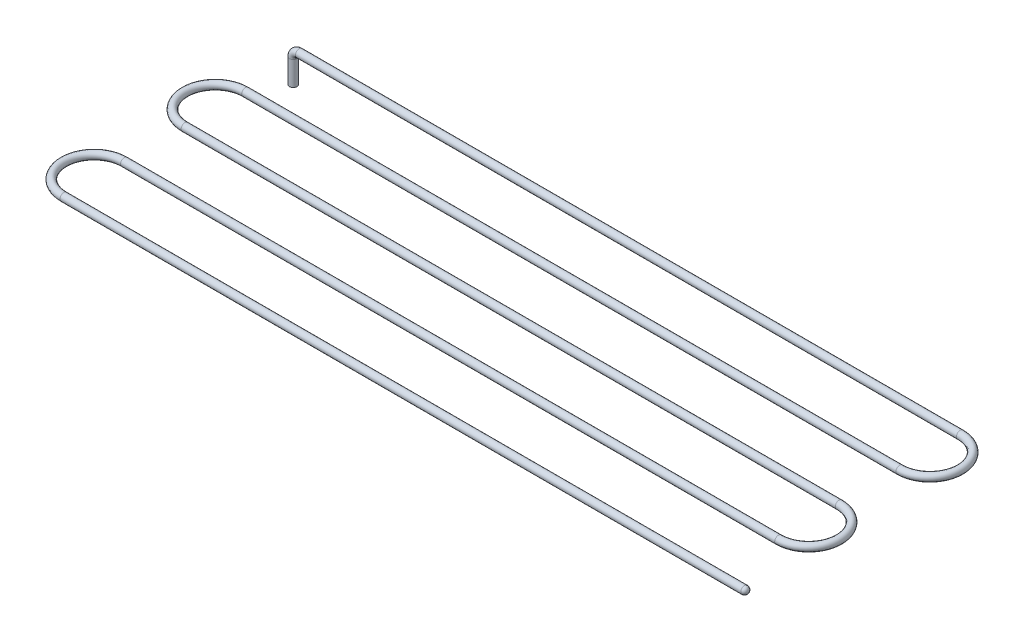
ISO-10303-21;
HEADER;
FILE_DESCRIPTION(('STEP AP214'),'2;1');
FILE_NAME('part.step','',(''),(''),'','','');
FILE_SCHEMA(('AUTOMOTIVE_DESIGN { 1 0 10303 214 1 1 1 1 }'));
ENDSEC;
DATA;
#1=APPLICATION_CONTEXT('core data for automotive mechanical design processes');
#2=APPLICATION_PROTOCOL_DEFINITION('international standard','automotive_design',2000,#1);
#3=PRODUCT_CONTEXT('',#1,'mechanical');
#4=PRODUCT('Part','Part','',(#3));
#5=PRODUCT_RELATED_PRODUCT_CATEGORY('part','',(#4));
#6=PRODUCT_DEFINITION_FORMATION('','',#4);
#7=PRODUCT_DEFINITION_CONTEXT('part definition',#1,'design');
#8=PRODUCT_DEFINITION('design','',#6,#7);
#9=PRODUCT_DEFINITION_SHAPE('','',#8);
#10=(LENGTH_UNIT() NAMED_UNIT(*) SI_UNIT(.MILLI.,.METRE.));
#11=(NAMED_UNIT(*) PLANE_ANGLE_UNIT() SI_UNIT($,.RADIAN.));
#12=(NAMED_UNIT(*) SI_UNIT($,.STERADIAN.) SOLID_ANGLE_UNIT());
#13=UNCERTAINTY_MEASURE_WITH_UNIT(LENGTH_MEASURE(1.E-05),#10,'distance_accuracy_value','');
#14=(GEOMETRIC_REPRESENTATION_CONTEXT(3) GLOBAL_UNCERTAINTY_ASSIGNED_CONTEXT((#13)) GLOBAL_UNIT_ASSIGNED_CONTEXT((#10,
#11,#12)) REPRESENTATION_CONTEXT('',''));
#15=CARTESIAN_POINT('',(0.,0.,0.));
#16=DIRECTION('',(0.,0.,1.));
#17=DIRECTION('',(1.,0.,0.));
#18=AXIS2_PLACEMENT_3D('',#15,#16,#17);
#19=CARTESIAN_POINT('',(451.999999999999,0.,-160.));
#20=DIRECTION('',(-1.,0.,0.));
#21=DIRECTION('',(0.,0.,1.));
#22=AXIS2_PLACEMENT_3D('',#19,#20,#21);
#23=CYLINDRICAL_SURFACE('',#22,2.5);
#24=CARTESIAN_POINT('',(451.999999999999,0.,-160.));
#25=DIRECTION('',(1.,0.,0.));
#26=DIRECTION('',(0.,0.,-1.));
#27=AXIS2_PLACEMENT_3D('',#24,#25,#26);
#28=CIRCLE('',#27,2.5);
#29=CARTESIAN_POINT('',(451.999999999999,0.,-162.5));
#30=VERTEX_POINT('',#29);
#31=EDGE_CURVE('E46',#30,#30,#28,.T.);
#32=ORIENTED_EDGE('',*,*,#31,.F.);
#33=EDGE_LOOP('',(#32));
#34=FACE_BOUND('',#33,.T.);
#35=CARTESIAN_POINT('',(15.4999999999995,0.,-160.));
#36=DIRECTION('',(-1.,0.,0.));
#37=DIRECTION('',(0.,0.,1.));
#38=AXIS2_PLACEMENT_3D('',#35,#36,#37);
#39=CIRCLE('',#38,2.5);
#40=CARTESIAN_POINT('',(15.4999999999995,2.5,-160.));
#41=VERTEX_POINT('',#40);
#42=EDGE_CURVE('E79',#41,#41,#39,.T.);
#43=ORIENTED_EDGE('',*,*,#42,.F.);
#44=EDGE_LOOP('',(#43));
#45=FACE_BOUND('',#44,.T.);
#46=ADVANCED_FACE('F35',(#34,#45),#23,.T.);
#47=CARTESIAN_POINT('',(452.,0.,-140.));
#48=DIRECTION('',(0.,1.,0.));
#49=DIRECTION('',(0.,0.,1.));
#50=AXIS2_PLACEMENT_3D('',#47,#48,#49);
#51=TOROIDAL_SURFACE('',#50,20.,2.5);
#52=CARTESIAN_POINT('',(452.000000000001,0.,-120.));
#53=DIRECTION('',(-1.,0.,0.));
#54=DIRECTION('',(0.,0.,1.));
#55=AXIS2_PLACEMENT_3D('',#52,#53,#54);
#56=CIRCLE('',#55,2.5);
#57=CARTESIAN_POINT('',(452.000000000001,0.,-117.5));
#58=VERTEX_POINT('',#57);
#59=EDGE_CURVE('E50',#58,#58,#56,.T.);
#60=CARTESIAN_POINT('',(452.,0.,-140.));
#61=DIRECTION('',(0.,1.,0.));
#62=DIRECTION('',(0.,0.,1.));
#63=AXIS2_PLACEMENT_3D('',#60,#61,#62);
#64=CIRCLE('',#63,22.5);
#65=EDGE_CURVE('',#58,#30,#64,.T.);
#66=ORIENTED_EDGE('',*,*,#59,.F.);
#67=ORIENTED_EDGE('',*,*,#31,.T.);
#68=ORIENTED_EDGE('',*,*,#65,.T.);
#69=ORIENTED_EDGE('',*,*,#65,.F.);
#70=EDGE_LOOP('',(#66,#68,#67,#69));
#71=FACE_BOUND('',#70,.T.);
#72=ADVANCED_FACE('F87',(#71),#51,.T.);
#73=CARTESIAN_POINT('',(20.0000000000005,0.,-120.));
#74=DIRECTION('',(1.,0.,0.));
#75=DIRECTION('',(0.,0.,-1.));
#76=AXIS2_PLACEMENT_3D('',#73,#74,#75);
#77=CYLINDRICAL_SURFACE('',#76,2.5);
#78=CARTESIAN_POINT('',(20.0000000000005,0.,-120.));
#79=DIRECTION('',(-1.,0.,0.));
#80=DIRECTION('',(0.,0.,1.));
#81=AXIS2_PLACEMENT_3D('',#78,#79,#80);
#82=CIRCLE('',#81,2.5);
#83=CARTESIAN_POINT('',(20.0000000000006,0.,-122.5));
#84=VERTEX_POINT('',#83);
#85=EDGE_CURVE('E55',#84,#84,#82,.T.);
#86=ORIENTED_EDGE('',*,*,#85,.F.);
#87=EDGE_LOOP('',(#86));
#88=FACE_BOUND('',#87,.T.);
#89=ORIENTED_EDGE('',*,*,#59,.T.);
#90=EDGE_LOOP('',(#89));
#91=FACE_BOUND('',#90,.T.);
#92=ADVANCED_FACE('F92',(#88,#91),#77,.T.);
#93=CARTESIAN_POINT('',(20.,0.,-100.));
#94=DIRECTION('',(0.,-1.,0.));
#95=DIRECTION('',(0.,0.,-1.));
#96=AXIS2_PLACEMENT_3D('',#93,#94,#95);
#97=TOROIDAL_SURFACE('',#96,20.,2.5);
#98=CARTESIAN_POINT('',(19.9999999999997,0.,-80.));
#99=DIRECTION('',(1.,0.,0.));
#100=DIRECTION('',(0.,0.,-1.));
#101=AXIS2_PLACEMENT_3D('',#98,#99,#100);
#102=CIRCLE('',#101,2.5);
#103=CARTESIAN_POINT('',(19.9999999999997,0.,-77.5));
#104=VERTEX_POINT('',#103);
#105=EDGE_CURVE('E58',#104,#104,#102,.T.);
#106=CARTESIAN_POINT('',(20.,0.,-100.));
#107=DIRECTION('',(0.,-1.,0.));
#108=DIRECTION('',(0.,0.,-1.));
#109=AXIS2_PLACEMENT_3D('',#106,#107,#108);
#110=CIRCLE('',#109,22.5);
#111=EDGE_CURVE('',#104,#84,#110,.T.);
#112=ORIENTED_EDGE('',*,*,#105,.F.);
#113=ORIENTED_EDGE('',*,*,#85,.T.);
#114=ORIENTED_EDGE('',*,*,#111,.T.);
#115=ORIENTED_EDGE('',*,*,#111,.F.);
#116=EDGE_LOOP('',(#112,#114,#113,#115));
#117=FACE_BOUND('',#116,.T.);
#118=ADVANCED_FACE('F99',(#117),#97,.T.);
#119=CARTESIAN_POINT('',(452.,0.,-80.));
#120=DIRECTION('',(-1.,0.,0.));
#121=DIRECTION('',(0.,0.,1.));
#122=AXIS2_PLACEMENT_3D('',#119,#120,#121);
#123=CYLINDRICAL_SURFACE('',#122,2.5);
#124=CARTESIAN_POINT('',(452.,0.,-80.));
#125=DIRECTION('',(1.,0.,0.));
#126=DIRECTION('',(0.,0.,-1.));
#127=AXIS2_PLACEMENT_3D('',#124,#125,#126);
#128=CIRCLE('',#127,2.5);
#129=CARTESIAN_POINT('',(452.,0.,-82.5));
#130=VERTEX_POINT('',#129);
#131=EDGE_CURVE('E61',#130,#130,#128,.T.);
#132=ORIENTED_EDGE('',*,*,#131,.F.);
#133=EDGE_LOOP('',(#132));
#134=FACE_BOUND('',#133,.T.);
#135=ORIENTED_EDGE('',*,*,#105,.T.);
#136=EDGE_LOOP('',(#135));
#137=FACE_BOUND('',#136,.T.);
#138=ADVANCED_FACE('F103',(#134,#137),#123,.T.);
#139=CARTESIAN_POINT('',(452.,0.,-60.));
#140=DIRECTION('',(0.,1.,0.));
#141=DIRECTION('',(0.,0.,1.));
#142=AXIS2_PLACEMENT_3D('',#139,#140,#141);
#143=TOROIDAL_SURFACE('',#142,20.,2.5);
#144=CARTESIAN_POINT('',(452.,0.,-40.));
#145=DIRECTION('',(-1.,0.,0.));
#146=DIRECTION('',(0.,0.,1.));
#147=AXIS2_PLACEMENT_3D('',#144,#145,#146);
#148=CIRCLE('',#147,2.5);
#149=CARTESIAN_POINT('',(452.,0.,-37.5));
#150=VERTEX_POINT('',#149);
#151=EDGE_CURVE('E64',#150,#150,#148,.T.);
#152=CARTESIAN_POINT('',(452.,0.,-60.));
#153=DIRECTION('',(0.,1.,0.));
#154=DIRECTION('',(0.,0.,1.));
#155=AXIS2_PLACEMENT_3D('',#152,#153,#154);
#156=CIRCLE('',#155,22.5);
#157=EDGE_CURVE('',#150,#130,#156,.T.);
#158=ORIENTED_EDGE('',*,*,#151,.F.);
#159=ORIENTED_EDGE('',*,*,#131,.T.);
#160=ORIENTED_EDGE('',*,*,#157,.T.);
#161=ORIENTED_EDGE('',*,*,#157,.F.);
#162=EDGE_LOOP('',(#158,#160,#159,#161));
#163=FACE_BOUND('',#162,.T.);
#164=ADVANCED_FACE('F107',(#163),#143,.T.);
#165=CARTESIAN_POINT('',(20.0000000000003,0.,-40.));
#166=DIRECTION('',(1.,0.,0.));
#167=DIRECTION('',(0.,0.,-1.));
#168=AXIS2_PLACEMENT_3D('',#165,#166,#167);
#169=CYLINDRICAL_SURFACE('',#168,2.5);
#170=CARTESIAN_POINT('',(20.0000000000003,0.,-40.));
#171=DIRECTION('',(-1.,0.,0.));
#172=DIRECTION('',(0.,0.,1.));
#173=AXIS2_PLACEMENT_3D('',#170,#171,#172);
#174=CIRCLE('',#173,2.5);
#175=CARTESIAN_POINT('',(20.0000000000003,0.,-42.5));
#176=VERTEX_POINT('',#175);
#177=EDGE_CURVE('E67',#176,#176,#174,.T.);
#178=ORIENTED_EDGE('',*,*,#177,.F.);
#179=EDGE_LOOP('',(#178));
#180=FACE_BOUND('',#179,.T.);
#181=ORIENTED_EDGE('',*,*,#151,.T.);
#182=EDGE_LOOP('',(#181));
#183=FACE_BOUND('',#182,.T.);
#184=ADVANCED_FACE('F111',(#180,#183),#169,.T.);
#185=CARTESIAN_POINT('',(20.,0.,-20.));
#186=DIRECTION('',(0.,-1.,0.));
#187=DIRECTION('',(0.,0.,-1.));
#188=AXIS2_PLACEMENT_3D('',#185,#186,#187);
#189=TOROIDAL_SURFACE('',#188,20.,2.5);
#190=CARTESIAN_POINT('',(20.,0.,0.));
#191=DIRECTION('',(1.,0.,0.));
#192=DIRECTION('',(0.,0.,-1.));
#193=AXIS2_PLACEMENT_3D('',#190,#191,#192);
#194=CIRCLE('',#193,2.5);
#195=CARTESIAN_POINT('',(20.,0.,2.5));
#196=VERTEX_POINT('',#195);
#197=EDGE_CURVE('E70',#196,#196,#194,.T.);
#198=CARTESIAN_POINT('',(20.,0.,-20.));
#199=DIRECTION('',(0.,-1.,0.));
#200=DIRECTION('',(0.,0.,-1.));
#201=AXIS2_PLACEMENT_3D('',#198,#199,#200);
#202=CIRCLE('',#201,22.5);
#203=EDGE_CURVE('',#196,#176,#202,.T.);
#204=ORIENTED_EDGE('',*,*,#197,.F.);
#205=ORIENTED_EDGE('',*,*,#177,.T.);
#206=ORIENTED_EDGE('',*,*,#203,.T.);
#207=ORIENTED_EDGE('',*,*,#203,.F.);
#208=EDGE_LOOP('',(#204,#206,#205,#207));
#209=FACE_BOUND('',#208,.T.);
#210=ADVANCED_FACE('F115',(#209),#189,.T.);
#211=CARTESIAN_POINT('',(20.,0.,0.));
#212=DIRECTION('',(1.,0.,0.));
#213=DIRECTION('',(0.,0.,-1.));
#214=AXIS2_PLACEMENT_3D('',#211,#212,#213);
#215=CYLINDRICAL_SURFACE('',#214,2.5);
#216=CARTESIAN_POINT('',(469.6,0.,0.));
#217=DIRECTION('',(1.,0.,0.));
#218=DIRECTION('',(0.,0.,-1.));
#219=AXIS2_PLACEMENT_3D('',#216,#217,#218);
#220=CIRCLE('',#219,2.5);
#221=CARTESIAN_POINT('',(469.6,0.,-2.5));
#222=VERTEX_POINT('',#221);
#223=EDGE_CURVE('E10',#222,#222,#220,.F.);
#224=ORIENTED_EDGE('',*,*,#223,.T.);
#225=EDGE_LOOP('',(#224));
#226=FACE_BOUND('',#225,.T.);
#227=ORIENTED_EDGE('',*,*,#197,.T.);
#228=EDGE_LOOP('',(#227));
#229=FACE_BOUND('',#228,.T.);
#230=ADVANCED_FACE('F119',(#226,#229),#215,.T.);
#231=CARTESIAN_POINT('',(472.,0.,0.));
#232=DIRECTION('',(1.,0.,0.));
#233=DIRECTION('',(0.,0.,-1.));
#234=AXIS2_PLACEMENT_3D('',#231,#232,#233);
#235=PLANE('',#234);
#236=CARTESIAN_POINT('',(472.,0.,0.));
#237=DIRECTION('',(1.,0.,0.));
#238=DIRECTION('',(0.,0.,-1.));
#239=AXIS2_PLACEMENT_3D('',#236,#237,#238);
#240=CIRCLE('',#239,0.1);
#241=CARTESIAN_POINT('',(472.,0.,-0.1));
#242=VERTEX_POINT('',#241);
#243=EDGE_CURVE('E42',#242,#242,#240,.T.);
#244=ORIENTED_EDGE('',*,*,#243,.T.);
#245=EDGE_LOOP('',(#244));
#246=FACE_BOUND('',#245,.T.);
#247=ADVANCED_FACE('F123',(#246),#235,.T.);
#248=CARTESIAN_POINT('',(469.6,0.,0.));
#249=DIRECTION('',(1.,0.,0.));
#250=DIRECTION('',(0.,0.,-1.));
#251=AXIS2_PLACEMENT_3D('',#248,#249,#250);
#252=DEGENERATE_TOROIDAL_SURFACE('',#251,0.1,2.4,.T.);
#253=ORIENTED_EDGE('',*,*,#223,.F.);
#254=EDGE_LOOP('',(#253));
#255=FACE_BOUND('',#254,.T.);
#256=ORIENTED_EDGE('',*,*,#243,.F.);
#257=EDGE_LOOP('',(#256));
#258=FACE_BOUND('',#257,.T.);
#259=ADVANCED_FACE('F37',(#255,#258),#252,.T.);
#260=CARTESIAN_POINT('',(11.4999999999995,-4.00000000000003,-160.));
#261=DIRECTION('',(0.,-1.,0.));
#262=DIRECTION('',(0.,0.,-1.));
#263=AXIS2_PLACEMENT_3D('',#260,#261,#262);
#264=CYLINDRICAL_SURFACE('',#263,2.5);
#265=CARTESIAN_POINT('',(11.4999999999995,-4.00000000000003,-160.));
#266=DIRECTION('',(0.,-1.,0.));
#267=DIRECTION('',(0.,0.,1.));
#268=AXIS2_PLACEMENT_3D('',#265,#266,#267);
#269=CIRCLE('',#268,2.5);
#270=CARTESIAN_POINT('',(8.99999999999947,-4.00000000000005,-160.));
#271=VERTEX_POINT('',#270);
#272=EDGE_CURVE('E76',#271,#271,#269,.T.);
#273=ORIENTED_EDGE('',*,*,#272,.T.);
#274=EDGE_LOOP('',(#273));
#275=FACE_BOUND('',#274,.T.);
#276=CARTESIAN_POINT('',(11.4999999999995,-20.,-160.));
#277=DIRECTION('',(0.,-1.,0.));
#278=DIRECTION('',(0.,0.,1.));
#279=AXIS2_PLACEMENT_3D('',#276,#277,#278);
#280=CIRCLE('',#279,2.5);
#281=CARTESIAN_POINT('',(11.4999999999995,-20.0000000000001,-157.5));
#282=VERTEX_POINT('',#281);
#283=EDGE_CURVE('E73',#282,#282,#280,.T.);
#284=ORIENTED_EDGE('',*,*,#283,.F.);
#285=EDGE_LOOP('',(#284));
#286=FACE_BOUND('',#285,.T.);
#287=ADVANCED_FACE('F126',(#275,#286),#264,.T.);
#288=CARTESIAN_POINT('',(15.4999999999995,-4.,-160.));
#289=DIRECTION('',(0.,0.,1.));
#290=DIRECTION('',(1.,0.,0.));
#291=AXIS2_PLACEMENT_3D('',#288,#289,#290);
#292=TOROIDAL_SURFACE('',#291,4.,2.5);
#293=CARTESIAN_POINT('',(15.4999999999995,-4.,-160.));
#294=DIRECTION('',(0.,0.,1.));
#295=DIRECTION('',(1.,0.,0.));
#296=AXIS2_PLACEMENT_3D('',#293,#294,#295);
#297=CIRCLE('',#296,6.5);
#298=EDGE_CURVE('',#41,#271,#297,.T.);
#299=ORIENTED_EDGE('',*,*,#42,.T.);
#300=ORIENTED_EDGE('',*,*,#272,.F.);
#301=ORIENTED_EDGE('',*,*,#298,.T.);
#302=ORIENTED_EDGE('',*,*,#298,.F.);
#303=EDGE_LOOP('',(#299,#301,#300,#302));
#304=FACE_BOUND('',#303,.T.);
#305=ADVANCED_FACE('F83',(#304),#292,.T.);
#306=CARTESIAN_POINT('',(11.4999999999995,-20.,-160.));
#307=DIRECTION('',(0.,-1.,0.));
#308=DIRECTION('',(0.,0.,1.));
#309=AXIS2_PLACEMENT_3D('',#306,#307,#308);
#310=PLANE('',#309);
#311=ORIENTED_EDGE('',*,*,#283,.T.);
#312=EDGE_LOOP('',(#311));
#313=FACE_BOUND('',#312,.T.);
#314=ADVANCED_FACE('F132',(#313),#310,.T.);
#315=CLOSED_SHELL('',(#46,#72,#92,#118,#138,#164,#184,#210,#230,#247,#259,#287,#305,#314));
#316=MANIFOLD_SOLID_BREP('B2',#315);
#317=ADVANCED_BREP_SHAPE_REPRESENTATION('',(#18,#316),#14);
#318=SHAPE_DEFINITION_REPRESENTATION(#9,#317);
ENDSEC;
END-ISO-10303-21;
